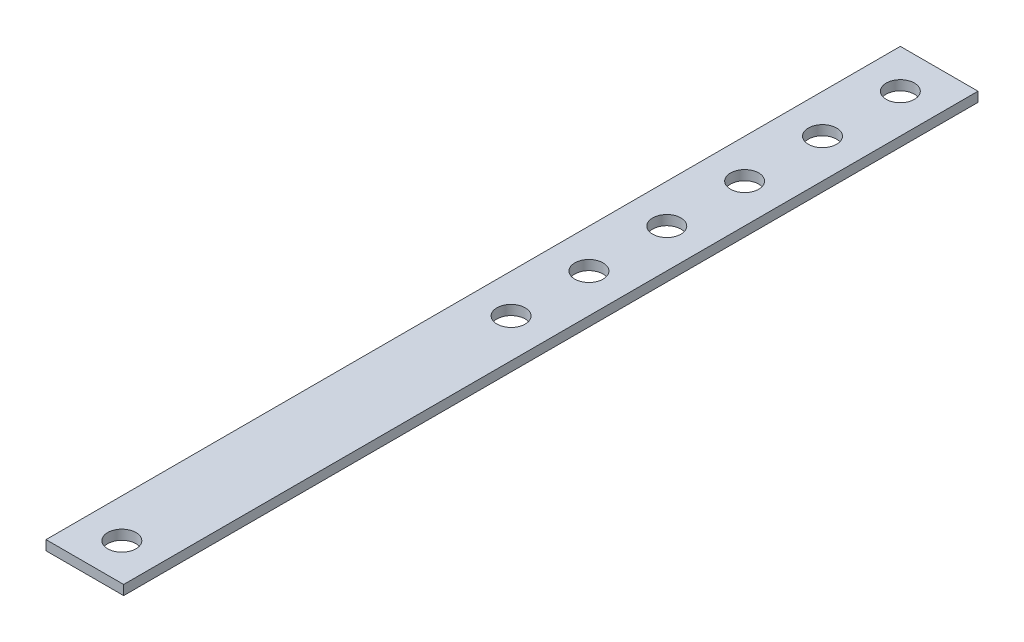
ISO-10303-21;
HEADER;
FILE_DESCRIPTION(('STEP AP214'),'2;1');
FILE_NAME('part.step','',(''),(''),'','','');
FILE_SCHEMA(('AUTOMOTIVE_DESIGN { 1 0 10303 214 1 1 1 1 }'));
ENDSEC;
DATA;
#1=APPLICATION_CONTEXT('core data for automotive mechanical design processes');
#2=APPLICATION_PROTOCOL_DEFINITION('international standard','automotive_design',2000,#1);
#3=PRODUCT_CONTEXT('',#1,'mechanical');
#4=PRODUCT('Part','Part','',(#3));
#5=PRODUCT_RELATED_PRODUCT_CATEGORY('part','',(#4));
#6=PRODUCT_DEFINITION_FORMATION('','',#4);
#7=PRODUCT_DEFINITION_CONTEXT('part definition',#1,'design');
#8=PRODUCT_DEFINITION('design','',#6,#7);
#9=PRODUCT_DEFINITION_SHAPE('','',#8);
#10=(LENGTH_UNIT() NAMED_UNIT(*) SI_UNIT(.MILLI.,.METRE.));
#11=(NAMED_UNIT(*) PLANE_ANGLE_UNIT() SI_UNIT($,.RADIAN.));
#12=(NAMED_UNIT(*) SI_UNIT($,.STERADIAN.) SOLID_ANGLE_UNIT());
#13=UNCERTAINTY_MEASURE_WITH_UNIT(LENGTH_MEASURE(1.E-05),#10,'distance_accuracy_value','');
#14=(GEOMETRIC_REPRESENTATION_CONTEXT(3) GLOBAL_UNCERTAINTY_ASSIGNED_CONTEXT((#13)) GLOBAL_UNIT_ASSIGNED_CONTEXT((#10,
#11,#12)) REPRESENTATION_CONTEXT('',''));
#15=CARTESIAN_POINT('',(0.,0.,0.));
#16=DIRECTION('',(0.,0.,1.));
#17=DIRECTION('',(1.,0.,0.));
#18=AXIS2_PLACEMENT_3D('',#15,#16,#17);
#19=CARTESIAN_POINT('',(0.,1.5875,0.));
#20=DIRECTION('',(0.,1.,0.));
#21=DIRECTION('',(0.,0.,1.));
#22=AXIS2_PLACEMENT_3D('',#19,#20,#21);
#23=PLANE('',#22);
#24=CARTESIAN_POINT('',(6.31291215572434,1.5875,-95.1875424257115));
#25=DIRECTION('',(0.,1.,0.));
#26=DIRECTION('',(0.,0.,1.));
#27=AXIS2_PLACEMENT_3D('',#24,#25,#26);
#28=CIRCLE('',#27,2.31);
#29=CARTESIAN_POINT('',(6.31291215572434,1.5875,-92.8775424257115));
#30=VERTEX_POINT('',#29);
#31=EDGE_CURVE('E139',#30,#30,#28,.T.);
#32=ORIENTED_EDGE('',*,*,#31,.F.);
#33=EDGE_LOOP('',(#32));
#34=FACE_BOUND('',#33,.T.);
#35=CARTESIAN_POINT('',(6.31291215572487,1.5875,-44.2675424257115));
#36=DIRECTION('',(0.,1.,0.));
#37=DIRECTION('',(0.,0.,1.));
#38=AXIS2_PLACEMENT_3D('',#35,#36,#37);
#39=CIRCLE('',#38,2.31);
#40=CARTESIAN_POINT('',(6.31291215572487,1.5875,-41.9575424257115));
#41=VERTEX_POINT('',#40);
#42=EDGE_CURVE('E127',#41,#41,#39,.T.);
#43=ORIENTED_EDGE('',*,*,#42,.F.);
#44=EDGE_LOOP('',(#43));
#45=FACE_BOUND('',#44,.T.);
#46=CARTESIAN_POINT('',(6.31291215572461,1.5875,-69.7275424257115));
#47=DIRECTION('',(0.,1.,0.));
#48=DIRECTION('',(0.,0.,1.));
#49=AXIS2_PLACEMENT_3D('',#46,#47,#48);
#50=CIRCLE('',#49,2.31);
#51=CARTESIAN_POINT('',(6.31291215572461,1.5875,-67.4175424257115));
#52=VERTEX_POINT('',#51);
#53=EDGE_CURVE('E115',#52,#52,#50,.T.);
#54=ORIENTED_EDGE('',*,*,#53,.F.);
#55=EDGE_LOOP('',(#54));
#56=FACE_BOUND('',#55,.T.);
#57=DIRECTION('',(0.,0.,1.));
#58=VECTOR('',#57,1.);
#59=CARTESIAN_POINT('',(-0.0370878442756614,1.5875,-101.537542425712));
#60=LINE('',#59,#58);
#61=CARTESIAN_POINT('',(-0.0370878442756614,1.5875,-101.537542425712));
#62=VERTEX_POINT('',#61);
#63=CARTESIAN_POINT('',(-0.0370878442756614,1.5875,38.1624575742885));
#64=VERTEX_POINT('',#63);
#65=EDGE_CURVE('E85',#62,#64,#60,.T.);
#66=ORIENTED_EDGE('',*,*,#65,.T.);
#67=DIRECTION('',(1.,0.,0.));
#68=VECTOR('',#67,1.);
#69=CARTESIAN_POINT('',(-0.0370878442756614,1.5875,38.1624575742885));
#70=LINE('',#69,#68);
#71=CARTESIAN_POINT('',(12.6629121557243,1.5875,38.1624575742885));
#72=VERTEX_POINT('',#71);
#73=EDGE_CURVE('E80',#64,#72,#70,.T.);
#74=ORIENTED_EDGE('',*,*,#73,.T.);
#75=DIRECTION('',(0.,0.,-1.));
#76=VECTOR('',#75,1.);
#77=CARTESIAN_POINT('',(12.6629121557243,1.5875,-101.537542425712));
#78=LINE('',#77,#76);
#79=CARTESIAN_POINT('',(12.6629121557243,1.5875,-101.537542425712));
#80=VERTEX_POINT('',#79);
#81=EDGE_CURVE('E83',#72,#80,#78,.T.);
#82=ORIENTED_EDGE('',*,*,#81,.T.);
#83=DIRECTION('',(-1.,0.,0.));
#84=VECTOR('',#83,1.);
#85=CARTESIAN_POINT('',(-0.0370878442756614,1.5875,-101.537542425712));
#86=LINE('',#85,#84);
#87=EDGE_CURVE('E50',#80,#62,#86,.T.);
#88=ORIENTED_EDGE('',*,*,#87,.T.);
#89=EDGE_LOOP('',(#66,#74,#82,#88));
#90=FACE_BOUND('',#89,.T.);
#91=CARTESIAN_POINT('',(6.31291215572447,1.5875,-82.4575424257115));
#92=DIRECTION('',(0.,1.,0.));
#93=DIRECTION('',(0.,0.,1.));
#94=AXIS2_PLACEMENT_3D('',#91,#92,#93);
#95=CIRCLE('',#94,2.31);
#96=CARTESIAN_POINT('',(6.31291215572447,1.5875,-80.1475424257115));
#97=VERTEX_POINT('',#96);
#98=EDGE_CURVE('E100',#97,#97,#95,.T.);
#99=ORIENTED_EDGE('',*,*,#98,.F.);
#100=EDGE_LOOP('',(#99));
#101=FACE_BOUND('',#100,.T.);
#102=CARTESIAN_POINT('',(6.31291215572474,1.5875,-56.9975424257115));
#103=DIRECTION('',(0.,1.,0.));
#104=DIRECTION('',(0.,0.,1.));
#105=AXIS2_PLACEMENT_3D('',#102,#103,#104);
#106=CIRCLE('',#105,2.31);
#107=CARTESIAN_POINT('',(6.31291215572474,1.5875,-54.6875424257115));
#108=VERTEX_POINT('',#107);
#109=EDGE_CURVE('E121',#108,#108,#106,.T.);
#110=ORIENTED_EDGE('',*,*,#109,.F.);
#111=EDGE_LOOP('',(#110));
#112=FACE_BOUND('',#111,.T.);
#113=CARTESIAN_POINT('',(6.31291215572501,1.5875,-31.5375424257115));
#114=DIRECTION('',(0.,1.,0.));
#115=DIRECTION('',(0.,0.,1.));
#116=AXIS2_PLACEMENT_3D('',#113,#114,#115);
#117=CIRCLE('',#116,2.31);
#118=CARTESIAN_POINT('',(6.31291215572501,1.5875,-29.2275424257115));
#119=VERTEX_POINT('',#118);
#120=EDGE_CURVE('E133',#119,#119,#117,.T.);
#121=ORIENTED_EDGE('',*,*,#120,.F.);
#122=EDGE_LOOP('',(#121));
#123=FACE_BOUND('',#122,.T.);
#124=CARTESIAN_POINT('',(6.31291215572567,1.5875,32.1124575742885));
#125=DIRECTION('',(0.,1.,0.));
#126=DIRECTION('',(0.,0.,1.));
#127=AXIS2_PLACEMENT_3D('',#124,#125,#126);
#128=CIRCLE('',#127,2.31);
#129=CARTESIAN_POINT('',(6.31291215572567,1.5875,34.4224575742885));
#130=VERTEX_POINT('',#129);
#131=EDGE_CURVE('E145',#130,#130,#128,.T.);
#132=ORIENTED_EDGE('',*,*,#131,.F.);
#133=EDGE_LOOP('',(#132));
#134=FACE_BOUND('',#133,.T.);
#135=ADVANCED_FACE('F33',(#34,#45,#56,#90,#101,#112,#123,#134),#23,.T.);
#136=CARTESIAN_POINT('',(0.,0.,0.));
#137=DIRECTION('',(0.,1.,0.));
#138=DIRECTION('',(0.,0.,1.));
#139=AXIS2_PLACEMENT_3D('',#136,#137,#138);
#140=PLANE('',#139);
#141=DIRECTION('',(0.,0.,1.));
#142=VECTOR('',#141,1.);
#143=CARTESIAN_POINT('',(-0.0370878442756614,0.,-101.537542425712));
#144=LINE('',#143,#142);
#145=CARTESIAN_POINT('',(-0.0370878442756614,0.,-101.537542425712));
#146=VERTEX_POINT('',#145);
#147=CARTESIAN_POINT('',(-0.0370878442756614,0.,38.1624575742885));
#148=VERTEX_POINT('',#147);
#149=EDGE_CURVE('E97',#146,#148,#144,.T.);
#150=ORIENTED_EDGE('',*,*,#149,.F.);
#151=DIRECTION('',(-1.,0.,0.));
#152=VECTOR('',#151,1.);
#153=CARTESIAN_POINT('',(-0.0370878442756614,0.,-101.537542425712));
#154=LINE('',#153,#152);
#155=CARTESIAN_POINT('',(12.6629121557243,0.,-101.537542425712));
#156=VERTEX_POINT('',#155);
#157=EDGE_CURVE('E73',#156,#146,#154,.T.);
#158=ORIENTED_EDGE('',*,*,#157,.F.);
#159=DIRECTION('',(0.,0.,-1.));
#160=VECTOR('',#159,1.);
#161=CARTESIAN_POINT('',(12.6629121557243,0.,-101.537542425712));
#162=LINE('',#161,#160);
#163=CARTESIAN_POINT('',(12.6629121557243,0.,38.1624575742885));
#164=VERTEX_POINT('',#163);
#165=EDGE_CURVE('E67',#164,#156,#162,.T.);
#166=ORIENTED_EDGE('',*,*,#165,.F.);
#167=DIRECTION('',(1.,0.,0.));
#168=VECTOR('',#167,1.);
#169=CARTESIAN_POINT('',(-0.0370878442756614,0.,38.1624575742885));
#170=LINE('',#169,#168);
#171=EDGE_CURVE('E89',#148,#164,#170,.T.);
#172=ORIENTED_EDGE('',*,*,#171,.F.);
#173=EDGE_LOOP('',(#150,#158,#166,#172));
#174=FACE_BOUND('',#173,.T.);
#175=CARTESIAN_POINT('',(6.31291215572447,0.,-82.4575424257115));
#176=DIRECTION('',(0.,1.,0.));
#177=DIRECTION('',(0.,0.,1.));
#178=AXIS2_PLACEMENT_3D('',#175,#176,#177);
#179=CIRCLE('',#178,2.31);
#180=CARTESIAN_POINT('',(6.31291215572447,0.,-80.1475424257115));
#181=VERTEX_POINT('',#180);
#182=EDGE_CURVE('E112',#181,#181,#179,.T.);
#183=ORIENTED_EDGE('',*,*,#182,.T.);
#184=EDGE_LOOP('',(#183));
#185=FACE_BOUND('',#184,.T.);
#186=CARTESIAN_POINT('',(6.31291215572461,0.,-69.7275424257115));
#187=DIRECTION('',(0.,1.,0.));
#188=DIRECTION('',(0.,0.,1.));
#189=AXIS2_PLACEMENT_3D('',#186,#187,#188);
#190=CIRCLE('',#189,2.31);
#191=CARTESIAN_POINT('',(6.31291215572461,0.,-67.4175424257115));
#192=VERTEX_POINT('',#191);
#193=EDGE_CURVE('E118',#192,#192,#190,.T.);
#194=ORIENTED_EDGE('',*,*,#193,.T.);
#195=EDGE_LOOP('',(#194));
#196=FACE_BOUND('',#195,.T.);
#197=CARTESIAN_POINT('',(6.31291215572474,0.,-56.9975424257115));
#198=DIRECTION('',(0.,1.,0.));
#199=DIRECTION('',(0.,0.,1.));
#200=AXIS2_PLACEMENT_3D('',#197,#198,#199);
#201=CIRCLE('',#200,2.31);
#202=CARTESIAN_POINT('',(6.31291215572474,0.,-54.6875424257115));
#203=VERTEX_POINT('',#202);
#204=EDGE_CURVE('E124',#203,#203,#201,.T.);
#205=ORIENTED_EDGE('',*,*,#204,.T.);
#206=EDGE_LOOP('',(#205));
#207=FACE_BOUND('',#206,.T.);
#208=CARTESIAN_POINT('',(6.31291215572487,0.,-44.2675424257115));
#209=DIRECTION('',(0.,1.,0.));
#210=DIRECTION('',(0.,0.,1.));
#211=AXIS2_PLACEMENT_3D('',#208,#209,#210);
#212=CIRCLE('',#211,2.31);
#213=CARTESIAN_POINT('',(6.31291215572487,0.,-41.9575424257115));
#214=VERTEX_POINT('',#213);
#215=EDGE_CURVE('E130',#214,#214,#212,.T.);
#216=ORIENTED_EDGE('',*,*,#215,.T.);
#217=EDGE_LOOP('',(#216));
#218=FACE_BOUND('',#217,.T.);
#219=CARTESIAN_POINT('',(6.31291215572501,0.,-31.5375424257115));
#220=DIRECTION('',(0.,1.,0.));
#221=DIRECTION('',(0.,0.,1.));
#222=AXIS2_PLACEMENT_3D('',#219,#220,#221);
#223=CIRCLE('',#222,2.31);
#224=CARTESIAN_POINT('',(6.31291215572501,0.,-29.2275424257115));
#225=VERTEX_POINT('',#224);
#226=EDGE_CURVE('E136',#225,#225,#223,.T.);
#227=ORIENTED_EDGE('',*,*,#226,.T.);
#228=EDGE_LOOP('',(#227));
#229=FACE_BOUND('',#228,.T.);
#230=CARTESIAN_POINT('',(6.31291215572434,0.,-95.1875424257115));
#231=DIRECTION('',(0.,1.,0.));
#232=DIRECTION('',(0.,0.,1.));
#233=AXIS2_PLACEMENT_3D('',#230,#231,#232);
#234=CIRCLE('',#233,2.31);
#235=CARTESIAN_POINT('',(6.31291215572434,0.,-92.8775424257115));
#236=VERTEX_POINT('',#235);
#237=EDGE_CURVE('E142',#236,#236,#234,.T.);
#238=ORIENTED_EDGE('',*,*,#237,.T.);
#239=EDGE_LOOP('',(#238));
#240=FACE_BOUND('',#239,.T.);
#241=CARTESIAN_POINT('',(6.31291215572567,0.,32.1124575742885));
#242=DIRECTION('',(0.,1.,0.));
#243=DIRECTION('',(0.,0.,1.));
#244=AXIS2_PLACEMENT_3D('',#241,#242,#243);
#245=CIRCLE('',#244,2.31);
#246=CARTESIAN_POINT('',(6.31291215572567,0.,34.4224575742885));
#247=VERTEX_POINT('',#246);
#248=EDGE_CURVE('E148',#247,#247,#245,.T.);
#249=ORIENTED_EDGE('',*,*,#248,.T.);
#250=EDGE_LOOP('',(#249));
#251=FACE_BOUND('',#250,.T.);
#252=ADVANCED_FACE('F108',(#174,#185,#196,#207,#218,#229,#240,#251),#140,.F.);
#253=CARTESIAN_POINT('',(-0.0370878442756614,1.5875,-101.537542425712));
#254=DIRECTION('',(1.,0.,0.));
#255=DIRECTION('',(0.,0.,-1.));
#256=AXIS2_PLACEMENT_3D('',#253,#254,#255);
#257=PLANE('',#256);
#258=ORIENTED_EDGE('',*,*,#149,.T.);
#259=DIRECTION('',(0.,-1.,0.));
#260=VECTOR('',#259,1.);
#261=CARTESIAN_POINT('',(-0.0370878442756614,1.5875,38.1624575742885));
#262=LINE('',#261,#260);
#263=EDGE_CURVE('E11',#64,#148,#262,.T.);
#264=ORIENTED_EDGE('',*,*,#263,.F.);
#265=ORIENTED_EDGE('',*,*,#65,.F.);
#266=DIRECTION('',(0.,-1.,0.));
#267=VECTOR('',#266,1.);
#268=CARTESIAN_POINT('',(-0.0370878442756614,1.5875,-101.537542425712));
#269=LINE('',#268,#267);
#270=EDGE_CURVE('E93',#62,#146,#269,.T.);
#271=ORIENTED_EDGE('',*,*,#270,.T.);
#272=EDGE_LOOP('',(#258,#264,#265,#271));
#273=FACE_BOUND('',#272,.T.);
#274=ADVANCED_FACE('F35',(#273),#257,.F.);
#275=CARTESIAN_POINT('',(-0.0370878442756614,1.5875,38.1624575742885));
#276=DIRECTION('',(0.,0.,-1.));
#277=DIRECTION('',(-1.,0.,0.));
#278=AXIS2_PLACEMENT_3D('',#275,#276,#277);
#279=PLANE('',#278);
#280=ORIENTED_EDGE('',*,*,#171,.T.);
#281=DIRECTION('',(0.,-1.,0.));
#282=VECTOR('',#281,1.);
#283=CARTESIAN_POINT('',(12.6629121557243,1.5875,38.1624575742885));
#284=LINE('',#283,#282);
#285=EDGE_CURVE('E42',#72,#164,#284,.T.);
#286=ORIENTED_EDGE('',*,*,#285,.F.);
#287=ORIENTED_EDGE('',*,*,#73,.F.);
#288=ORIENTED_EDGE('',*,*,#263,.T.);
#289=EDGE_LOOP('',(#280,#286,#287,#288));
#290=FACE_BOUND('',#289,.T.);
#291=ADVANCED_FACE('F88',(#290),#279,.F.);
#292=CARTESIAN_POINT('',(12.6629121557243,1.5875,-101.537542425712));
#293=DIRECTION('',(-1.,0.,0.));
#294=DIRECTION('',(0.,0.,1.));
#295=AXIS2_PLACEMENT_3D('',#292,#293,#294);
#296=PLANE('',#295);
#297=ORIENTED_EDGE('',*,*,#165,.T.);
#298=DIRECTION('',(0.,-1.,0.));
#299=VECTOR('',#298,1.);
#300=CARTESIAN_POINT('',(12.6629121557243,1.5875,-101.537542425712));
#301=LINE('',#300,#299);
#302=EDGE_CURVE('E90',#80,#156,#301,.T.);
#303=ORIENTED_EDGE('',*,*,#302,.F.);
#304=ORIENTED_EDGE('',*,*,#81,.F.);
#305=ORIENTED_EDGE('',*,*,#285,.T.);
#306=EDGE_LOOP('',(#297,#303,#304,#305));
#307=FACE_BOUND('',#306,.T.);
#308=ADVANCED_FACE('F91',(#307),#296,.F.);
#309=CARTESIAN_POINT('',(-0.0370878442756614,1.5875,-101.537542425712));
#310=DIRECTION('',(0.,0.,1.));
#311=DIRECTION('',(1.,0.,0.));
#312=AXIS2_PLACEMENT_3D('',#309,#310,#311);
#313=PLANE('',#312);
#314=ORIENTED_EDGE('',*,*,#157,.T.);
#315=ORIENTED_EDGE('',*,*,#270,.F.);
#316=ORIENTED_EDGE('',*,*,#87,.F.);
#317=ORIENTED_EDGE('',*,*,#302,.T.);
#318=EDGE_LOOP('',(#314,#315,#316,#317));
#319=FACE_BOUND('',#318,.T.);
#320=ADVANCED_FACE('F105',(#319),#313,.F.);
#321=CARTESIAN_POINT('',(6.31291215572447,1.5875,-82.4575424257115));
#322=DIRECTION('',(0.,-1.,0.));
#323=DIRECTION('',(0.,0.,-1.));
#324=AXIS2_PLACEMENT_3D('',#321,#322,#323);
#325=CYLINDRICAL_SURFACE('',#324,2.31);
#326=ORIENTED_EDGE('',*,*,#98,.T.);
#327=EDGE_LOOP('',(#326));
#328=FACE_BOUND('',#327,.T.);
#329=ORIENTED_EDGE('',*,*,#182,.F.);
#330=EDGE_LOOP('',(#329));
#331=FACE_BOUND('',#330,.T.);
#332=ADVANCED_FACE('F167',(#328,#331),#325,.F.);
#333=CARTESIAN_POINT('',(6.31291215572461,1.5875,-69.7275424257115));
#334=DIRECTION('',(0.,-1.,0.));
#335=DIRECTION('',(0.,0.,-1.));
#336=AXIS2_PLACEMENT_3D('',#333,#334,#335);
#337=CYLINDRICAL_SURFACE('',#336,2.31);
#338=ORIENTED_EDGE('',*,*,#53,.T.);
#339=EDGE_LOOP('',(#338));
#340=FACE_BOUND('',#339,.T.);
#341=ORIENTED_EDGE('',*,*,#193,.F.);
#342=EDGE_LOOP('',(#341));
#343=FACE_BOUND('',#342,.T.);
#344=ADVANCED_FACE('F213',(#340,#343),#337,.F.);
#345=CARTESIAN_POINT('',(6.31291215572474,1.5875,-56.9975424257115));
#346=DIRECTION('',(0.,-1.,0.));
#347=DIRECTION('',(0.,0.,-1.));
#348=AXIS2_PLACEMENT_3D('',#345,#346,#347);
#349=CYLINDRICAL_SURFACE('',#348,2.31);
#350=ORIENTED_EDGE('',*,*,#109,.T.);
#351=EDGE_LOOP('',(#350));
#352=FACE_BOUND('',#351,.T.);
#353=ORIENTED_EDGE('',*,*,#204,.F.);
#354=EDGE_LOOP('',(#353));
#355=FACE_BOUND('',#354,.T.);
#356=ADVANCED_FACE('F221',(#352,#355),#349,.F.);
#357=CARTESIAN_POINT('',(6.31291215572487,1.5875,-44.2675424257115));
#358=DIRECTION('',(0.,-1.,0.));
#359=DIRECTION('',(0.,0.,-1.));
#360=AXIS2_PLACEMENT_3D('',#357,#358,#359);
#361=CYLINDRICAL_SURFACE('',#360,2.31);
#362=ORIENTED_EDGE('',*,*,#42,.T.);
#363=EDGE_LOOP('',(#362));
#364=FACE_BOUND('',#363,.T.);
#365=ORIENTED_EDGE('',*,*,#215,.F.);
#366=EDGE_LOOP('',(#365));
#367=FACE_BOUND('',#366,.T.);
#368=ADVANCED_FACE('F229',(#364,#367),#361,.F.);
#369=CARTESIAN_POINT('',(6.31291215572501,1.5875,-31.5375424257115));
#370=DIRECTION('',(0.,-1.,0.));
#371=DIRECTION('',(0.,0.,-1.));
#372=AXIS2_PLACEMENT_3D('',#369,#370,#371);
#373=CYLINDRICAL_SURFACE('',#372,2.31);
#374=ORIENTED_EDGE('',*,*,#120,.T.);
#375=EDGE_LOOP('',(#374));
#376=FACE_BOUND('',#375,.T.);
#377=ORIENTED_EDGE('',*,*,#226,.F.);
#378=EDGE_LOOP('',(#377));
#379=FACE_BOUND('',#378,.T.);
#380=ADVANCED_FACE('F238',(#376,#379),#373,.F.);
#381=CARTESIAN_POINT('',(6.31291215572434,1.5875,-95.1875424257115));
#382=DIRECTION('',(0.,-1.,0.));
#383=DIRECTION('',(0.,0.,-1.));
#384=AXIS2_PLACEMENT_3D('',#381,#382,#383);
#385=CYLINDRICAL_SURFACE('',#384,2.31);
#386=ORIENTED_EDGE('',*,*,#31,.T.);
#387=EDGE_LOOP('',(#386));
#388=FACE_BOUND('',#387,.T.);
#389=ORIENTED_EDGE('',*,*,#237,.F.);
#390=EDGE_LOOP('',(#389));
#391=FACE_BOUND('',#390,.T.);
#392=ADVANCED_FACE('F247',(#388,#391),#385,.F.);
#393=CARTESIAN_POINT('',(6.31291215572567,1.5875,32.1124575742885));
#394=DIRECTION('',(0.,-1.,0.));
#395=DIRECTION('',(0.,0.,-1.));
#396=AXIS2_PLACEMENT_3D('',#393,#394,#395);
#397=CYLINDRICAL_SURFACE('',#396,2.31);
#398=ORIENTED_EDGE('',*,*,#131,.T.);
#399=EDGE_LOOP('',(#398));
#400=FACE_BOUND('',#399,.T.);
#401=ORIENTED_EDGE('',*,*,#248,.F.);
#402=EDGE_LOOP('',(#401));
#403=FACE_BOUND('',#402,.T.);
#404=ADVANCED_FACE('F154',(#400,#403),#397,.F.);
#405=CLOSED_SHELL('',(#135,#252,#274,#291,#308,#320,#332,#344,#356,#368,#380,#392,#404));
#406=MANIFOLD_SOLID_BREP('B2',#405);
#407=ADVANCED_BREP_SHAPE_REPRESENTATION('',(#18,#406),#14);
#408=SHAPE_DEFINITION_REPRESENTATION(#9,#407);
ENDSEC;
END-ISO-10303-21;
